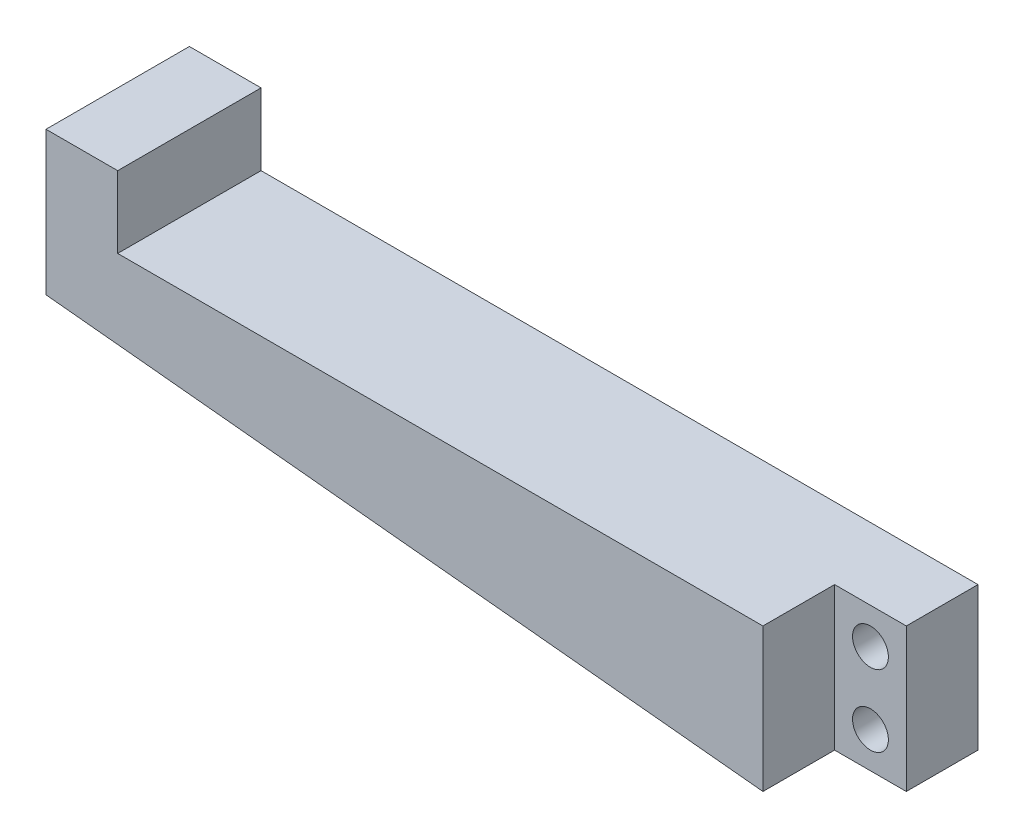
ISO-10303-21;
HEADER;
FILE_DESCRIPTION(('STEP AP214'),'2;1');
FILE_NAME('part.step','',(''),(''),'','','');
FILE_SCHEMA(('AUTOMOTIVE_DESIGN { 1 0 10303 214 1 1 1 1 }'));
ENDSEC;
DATA;
#1=APPLICATION_CONTEXT('core data for automotive mechanical design processes');
#2=APPLICATION_PROTOCOL_DEFINITION('international standard','automotive_design',2000,#1);
#3=PRODUCT_CONTEXT('',#1,'mechanical');
#4=PRODUCT('Part','Part','',(#3));
#5=PRODUCT_RELATED_PRODUCT_CATEGORY('part','',(#4));
#6=PRODUCT_DEFINITION_FORMATION('','',#4);
#7=PRODUCT_DEFINITION_CONTEXT('part definition',#1,'design');
#8=PRODUCT_DEFINITION('design','',#6,#7);
#9=PRODUCT_DEFINITION_SHAPE('','',#8);
#10=(LENGTH_UNIT() NAMED_UNIT(*) SI_UNIT(.MILLI.,.METRE.));
#11=(NAMED_UNIT(*) PLANE_ANGLE_UNIT() SI_UNIT($,.RADIAN.));
#12=(NAMED_UNIT(*) SI_UNIT($,.STERADIAN.) SOLID_ANGLE_UNIT());
#13=UNCERTAINTY_MEASURE_WITH_UNIT(LENGTH_MEASURE(1.E-05),#10,'distance_accuracy_value','');
#14=(GEOMETRIC_REPRESENTATION_CONTEXT(3) GLOBAL_UNCERTAINTY_ASSIGNED_CONTEXT((#13)) GLOBAL_UNIT_ASSIGNED_CONTEXT((#10,
#11,#12)) REPRESENTATION_CONTEXT('',''));
#15=CARTESIAN_POINT('',(0.,0.,0.));
#16=DIRECTION('',(0.,0.,1.));
#17=DIRECTION('',(1.,0.,0.));
#18=AXIS2_PLACEMENT_3D('',#15,#16,#17);
#19=CARTESIAN_POINT('',(0.,0.,20.));
#20=DIRECTION('',(0.,0.,-1.));
#21=DIRECTION('',(-1.,0.,0.));
#22=AXIS2_PLACEMENT_3D('',#19,#20,#21);
#23=PLANE('',#22);
#24=DIRECTION('',(0.995037190209989,-0.0995037190209987,0.));
#25=VECTOR('',#24,1.);
#26=CARTESIAN_POINT('',(-105.,0.,20.));
#27=LINE('',#26,#25);
#28=CARTESIAN_POINT('',(-105.,0.,20.));
#29=VERTEX_POINT('',#28);
#30=CARTESIAN_POINT('',(-5.,-10.,20.));
#31=VERTEX_POINT('',#30);
#32=EDGE_CURVE('E125',#29,#31,#27,.T.);
#33=ORIENTED_EDGE('',*,*,#32,.T.);
#34=DIRECTION('',(0.,-1.,0.));
#35=VECTOR('',#34,1.);
#36=CARTESIAN_POINT('',(-5.,-10.,20.));
#37=LINE('',#36,#35);
#38=CARTESIAN_POINT('',(-5.,10.,20.));
#39=VERTEX_POINT('',#38);
#40=EDGE_CURVE('E190',#39,#31,#37,.T.);
#41=ORIENTED_EDGE('',*,*,#40,.F.);
#42=DIRECTION('',(-1.,0.,0.));
#43=VECTOR('',#42,1.);
#44=CARTESIAN_POINT('',(-5.,10.,20.));
#45=LINE('',#44,#43);
#46=CARTESIAN_POINT('',(-95.,9.99999999999999,20.));
#47=VERTEX_POINT('',#46);
#48=EDGE_CURVE('E95',#39,#47,#45,.T.);
#49=ORIENTED_EDGE('',*,*,#48,.T.);
#50=DIRECTION('',(0.,1.,0.));
#51=VECTOR('',#50,1.);
#52=CARTESIAN_POINT('',(-95.,9.99999999999999,20.));
#53=LINE('',#52,#51);
#54=CARTESIAN_POINT('',(-95.,20.,20.));
#55=VERTEX_POINT('',#54);
#56=EDGE_CURVE('E149',#47,#55,#53,.T.);
#57=ORIENTED_EDGE('',*,*,#56,.T.);
#58=DIRECTION('',(-1.,0.,0.));
#59=VECTOR('',#58,1.);
#60=CARTESIAN_POINT('',(-105.,20.,20.));
#61=LINE('',#60,#59);
#62=CARTESIAN_POINT('',(-105.,20.,20.));
#63=VERTEX_POINT('',#62);
#64=EDGE_CURVE('E171',#55,#63,#61,.T.);
#65=ORIENTED_EDGE('',*,*,#64,.T.);
#66=DIRECTION('',(0.,-1.,0.));
#67=VECTOR('',#66,1.);
#68=CARTESIAN_POINT('',(-105.,9.99999999999999,20.));
#69=LINE('',#68,#67);
#70=EDGE_CURVE('E58',#63,#29,#69,.T.);
#71=ORIENTED_EDGE('',*,*,#70,.T.);
#72=EDGE_LOOP('',(#33,#41,#49,#57,#65,#71));
#73=FACE_BOUND('',#72,.T.);
#74=ADVANCED_FACE('F33',(#73),#23,.F.);
#75=CARTESIAN_POINT('',(0.,0.,0.));
#76=DIRECTION('',(0.,0.,-1.));
#77=DIRECTION('',(-1.,0.,0.));
#78=AXIS2_PLACEMENT_3D('',#75,#76,#77);
#79=PLANE('',#78);
#80=CARTESIAN_POINT('',(0.,5.,0.));
#81=DIRECTION('',(0.,0.,1.));
#82=DIRECTION('',(1.,0.,0.));
#83=AXIS2_PLACEMENT_3D('',#80,#81,#82);
#84=CIRCLE('',#83,2.5);
#85=CARTESIAN_POINT('',(2.5,5.,0.));
#86=VERTEX_POINT('',#85);
#87=EDGE_CURVE('E174',#86,#86,#84,.T.);
#88=ORIENTED_EDGE('',*,*,#87,.T.);
#89=EDGE_LOOP('',(#88));
#90=FACE_BOUND('',#89,.T.);
#91=DIRECTION('',(0.,1.,0.));
#92=VECTOR('',#91,1.);
#93=CARTESIAN_POINT('',(5.,-10.,0.));
#94=LINE('',#93,#92);
#95=CARTESIAN_POINT('',(5.,-10.,0.));
#96=VERTEX_POINT('',#95);
#97=CARTESIAN_POINT('',(5.,10.,0.));
#98=VERTEX_POINT('',#97);
#99=EDGE_CURVE('E162',#96,#98,#94,.T.);
#100=ORIENTED_EDGE('',*,*,#99,.F.);
#101=DIRECTION('',(1.,0.,0.));
#102=VECTOR('',#101,1.);
#103=CARTESIAN_POINT('',(-5.,-10.,0.));
#104=LINE('',#103,#102);
#105=CARTESIAN_POINT('',(-5.,-10.,0.));
#106=VERTEX_POINT('',#105);
#107=EDGE_CURVE('E122',#106,#96,#104,.T.);
#108=ORIENTED_EDGE('',*,*,#107,.F.);
#109=DIRECTION('',(0.995037190209989,-0.0995037190209987,0.));
#110=VECTOR('',#109,1.);
#111=CARTESIAN_POINT('',(-105.,0.,0.));
#112=LINE('',#111,#110);
#113=CARTESIAN_POINT('',(-105.,0.,0.));
#114=VERTEX_POINT('',#113);
#115=EDGE_CURVE('E166',#114,#106,#112,.T.);
#116=ORIENTED_EDGE('',*,*,#115,.F.);
#117=DIRECTION('',(0.,-1.,0.));
#118=VECTOR('',#117,1.);
#119=CARTESIAN_POINT('',(-105.,9.99999999999999,0.));
#120=LINE('',#119,#118);
#121=CARTESIAN_POINT('',(-105.,20.,0.));
#122=VERTEX_POINT('',#121);
#123=EDGE_CURVE('E160',#122,#114,#120,.T.);
#124=ORIENTED_EDGE('',*,*,#123,.F.);
#125=DIRECTION('',(-1.,0.,0.));
#126=VECTOR('',#125,1.);
#127=CARTESIAN_POINT('',(-105.,20.,0.));
#128=LINE('',#127,#126);
#129=CARTESIAN_POINT('',(-95.,20.,0.));
#130=VERTEX_POINT('',#129);
#131=EDGE_CURVE('E158',#130,#122,#128,.T.);
#132=ORIENTED_EDGE('',*,*,#131,.F.);
#133=DIRECTION('',(0.,1.,0.));
#134=VECTOR('',#133,1.);
#135=CARTESIAN_POINT('',(-95.,9.99999999999999,0.));
#136=LINE('',#135,#134);
#137=CARTESIAN_POINT('',(-95.,9.99999999999999,0.));
#138=VERTEX_POINT('',#137);
#139=EDGE_CURVE('E148',#138,#130,#136,.T.);
#140=ORIENTED_EDGE('',*,*,#139,.F.);
#141=DIRECTION('',(-1.,0.,0.));
#142=VECTOR('',#141,1.);
#143=CARTESIAN_POINT('',(-5.,10.,0.));
#144=LINE('',#143,#142);
#145=EDGE_CURVE('E156',#98,#138,#144,.T.);
#146=ORIENTED_EDGE('',*,*,#145,.F.);
#147=EDGE_LOOP('',(#100,#108,#116,#124,#132,#140,#146));
#148=FACE_BOUND('',#147,.T.);
#149=CARTESIAN_POINT('',(0.,-5.,0.));
#150=DIRECTION('',(0.,0.,1.));
#151=DIRECTION('',(1.,0.,0.));
#152=AXIS2_PLACEMENT_3D('',#149,#150,#151);
#153=CIRCLE('',#152,2.5);
#154=CARTESIAN_POINT('',(2.5,-5.,0.));
#155=VERTEX_POINT('',#154);
#156=EDGE_CURVE('E179',#155,#155,#153,.T.);
#157=ORIENTED_EDGE('',*,*,#156,.T.);
#158=EDGE_LOOP('',(#157));
#159=FACE_BOUND('',#158,.T.);
#160=ADVANCED_FACE('F154',(#90,#148,#159),#79,.T.);
#161=CARTESIAN_POINT('',(5.,-10.,20.));
#162=DIRECTION('',(-1.,0.,0.));
#163=DIRECTION('',(0.,0.,1.));
#164=AXIS2_PLACEMENT_3D('',#161,#162,#163);
#165=PLANE('',#164);
#166=DIRECTION('',(0.,0.,-1.));
#167=VECTOR('',#166,1.);
#168=CARTESIAN_POINT('',(5.,10.,20.));
#169=LINE('',#168,#167);
#170=CARTESIAN_POINT('',(5.,10.,10.));
#171=VERTEX_POINT('',#170);
#172=EDGE_CURVE('E11',#171,#98,#169,.T.);
#173=ORIENTED_EDGE('',*,*,#172,.F.);
#174=DIRECTION('',(0.,1.,0.));
#175=VECTOR('',#174,1.);
#176=CARTESIAN_POINT('',(5.,-10.,10.));
#177=LINE('',#176,#175);
#178=CARTESIAN_POINT('',(5.,-10.,10.));
#179=VERTEX_POINT('',#178);
#180=EDGE_CURVE('E112',#179,#171,#177,.T.);
#181=ORIENTED_EDGE('',*,*,#180,.F.);
#182=DIRECTION('',(0.,0.,-1.));
#183=VECTOR('',#182,1.);
#184=CARTESIAN_POINT('',(5.,-10.,20.));
#185=LINE('',#184,#183);
#186=EDGE_CURVE('E88',#179,#96,#185,.T.);
#187=ORIENTED_EDGE('',*,*,#186,.T.);
#188=ORIENTED_EDGE('',*,*,#99,.T.);
#189=EDGE_LOOP('',(#173,#181,#187,#188));
#190=FACE_BOUND('',#189,.T.);
#191=ADVANCED_FACE('F35',(#190),#165,.F.);
#192=CARTESIAN_POINT('',(-5.,10.,20.));
#193=DIRECTION('',(0.,-1.,0.));
#194=DIRECTION('',(1.,0.,0.));
#195=AXIS2_PLACEMENT_3D('',#192,#193,#194);
#196=PLANE('',#195);
#197=ORIENTED_EDGE('',*,*,#48,.F.);
#198=DIRECTION('',(0.,0.,1.));
#199=VECTOR('',#198,1.);
#200=CARTESIAN_POINT('',(-5.,10.,10.));
#201=LINE('',#200,#199);
#202=CARTESIAN_POINT('',(-5.,10.,10.));
#203=VERTEX_POINT('',#202);
#204=EDGE_CURVE('E188',#203,#39,#201,.T.);
#205=ORIENTED_EDGE('',*,*,#204,.F.);
#206=DIRECTION('',(-1.,0.,0.));
#207=VECTOR('',#206,1.);
#208=CARTESIAN_POINT('',(-5.,10.,10.));
#209=LINE('',#208,#207);
#210=EDGE_CURVE('E118',#171,#203,#209,.T.);
#211=ORIENTED_EDGE('',*,*,#210,.F.);
#212=ORIENTED_EDGE('',*,*,#172,.T.);
#213=ORIENTED_EDGE('',*,*,#145,.T.);
#214=DIRECTION('',(0.,0.,-1.));
#215=VECTOR('',#214,1.);
#216=CARTESIAN_POINT('',(-95.,9.99999999999999,20.));
#217=LINE('',#216,#215);
#218=EDGE_CURVE('E42',#47,#138,#217,.T.);
#219=ORIENTED_EDGE('',*,*,#218,.F.);
#220=EDGE_LOOP('',(#197,#205,#211,#212,#213,#219));
#221=FACE_BOUND('',#220,.T.);
#222=ADVANCED_FACE('F194',(#221),#196,.F.);
#223=CARTESIAN_POINT('',(-95.,9.99999999999999,20.));
#224=DIRECTION('',(-1.,0.,0.));
#225=DIRECTION('',(0.,0.,1.));
#226=AXIS2_PLACEMENT_3D('',#223,#224,#225);
#227=PLANE('',#226);
#228=ORIENTED_EDGE('',*,*,#139,.T.);
#229=DIRECTION('',(0.,0.,-1.));
#230=VECTOR('',#229,1.);
#231=CARTESIAN_POINT('',(-95.,20.,20.));
#232=LINE('',#231,#230);
#233=EDGE_CURVE('E139',#55,#130,#232,.T.);
#234=ORIENTED_EDGE('',*,*,#233,.F.);
#235=ORIENTED_EDGE('',*,*,#56,.F.);
#236=ORIENTED_EDGE('',*,*,#218,.T.);
#237=EDGE_LOOP('',(#228,#234,#235,#236));
#238=FACE_BOUND('',#237,.T.);
#239=ADVANCED_FACE('F146',(#238),#227,.F.);
#240=CARTESIAN_POINT('',(-105.,20.,20.));
#241=DIRECTION('',(0.,-1.,0.));
#242=DIRECTION('',(0.,0.,-1.));
#243=AXIS2_PLACEMENT_3D('',#240,#241,#242);
#244=PLANE('',#243);
#245=ORIENTED_EDGE('',*,*,#131,.T.);
#246=DIRECTION('',(0.,0.,-1.));
#247=VECTOR('',#246,1.);
#248=CARTESIAN_POINT('',(-105.,20.,20.));
#249=LINE('',#248,#247);
#250=EDGE_CURVE('E136',#63,#122,#249,.T.);
#251=ORIENTED_EDGE('',*,*,#250,.F.);
#252=ORIENTED_EDGE('',*,*,#64,.F.);
#253=ORIENTED_EDGE('',*,*,#233,.T.);
#254=EDGE_LOOP('',(#245,#251,#252,#253));
#255=FACE_BOUND('',#254,.T.);
#256=ADVANCED_FACE('F209',(#255),#244,.F.);
#257=CARTESIAN_POINT('',(-105.,9.99999999999999,20.));
#258=DIRECTION('',(1.,0.,0.));
#259=DIRECTION('',(0.,0.,-1.));
#260=AXIS2_PLACEMENT_3D('',#257,#258,#259);
#261=PLANE('',#260);
#262=ORIENTED_EDGE('',*,*,#123,.T.);
#263=DIRECTION('',(0.,0.,-1.));
#264=VECTOR('',#263,1.);
#265=CARTESIAN_POINT('',(-105.,0.,20.));
#266=LINE('',#265,#264);
#267=EDGE_CURVE('E133',#29,#114,#266,.T.);
#268=ORIENTED_EDGE('',*,*,#267,.F.);
#269=ORIENTED_EDGE('',*,*,#70,.F.);
#270=ORIENTED_EDGE('',*,*,#250,.T.);
#271=EDGE_LOOP('',(#262,#268,#269,#270));
#272=FACE_BOUND('',#271,.T.);
#273=ADVANCED_FACE('F201',(#272),#261,.F.);
#274=CARTESIAN_POINT('',(-105.,0.,20.));
#275=DIRECTION('',(0.0995037190209987,0.995037190209989,0.));
#276=DIRECTION('',(-0.995037190209989,0.0995037190209988,0.));
#277=AXIS2_PLACEMENT_3D('',#274,#275,#276);
#278=PLANE('',#277);
#279=ORIENTED_EDGE('',*,*,#115,.T.);
#280=DIRECTION('',(0.,0.,-1.));
#281=VECTOR('',#280,1.);
#282=CARTESIAN_POINT('',(-5.,-10.,20.));
#283=LINE('',#282,#281);
#284=CARTESIAN_POINT('',(-5.,-10.,10.));
#285=VERTEX_POINT('',#284);
#286=EDGE_CURVE('E124',#285,#106,#283,.T.);
#287=ORIENTED_EDGE('',*,*,#286,.F.);
#288=EDGE_CURVE('E127',#31,#285,#283,.T.);
#289=ORIENTED_EDGE('',*,*,#288,.F.);
#290=ORIENTED_EDGE('',*,*,#32,.F.);
#291=ORIENTED_EDGE('',*,*,#267,.T.);
#292=EDGE_LOOP('',(#279,#287,#289,#290,#291));
#293=FACE_BOUND('',#292,.T.);
#294=ADVANCED_FACE('F199',(#293),#278,.F.);
#295=CARTESIAN_POINT('',(-5.,-10.,20.));
#296=DIRECTION('',(0.,1.,0.));
#297=DIRECTION('',(0.,0.,1.));
#298=AXIS2_PLACEMENT_3D('',#295,#296,#297);
#299=PLANE('',#298);
#300=ORIENTED_EDGE('',*,*,#186,.F.);
#301=DIRECTION('',(1.,0.,0.));
#302=VECTOR('',#301,1.);
#303=CARTESIAN_POINT('',(-5.,-10.,10.));
#304=LINE('',#303,#302);
#305=EDGE_CURVE('E110',#285,#179,#304,.T.);
#306=ORIENTED_EDGE('',*,*,#305,.F.);
#307=ORIENTED_EDGE('',*,*,#286,.T.);
#308=ORIENTED_EDGE('',*,*,#107,.T.);
#309=EDGE_LOOP('',(#300,#306,#307,#308));
#310=FACE_BOUND('',#309,.T.);
#311=ADVANCED_FACE('F120',(#310),#299,.F.);
#312=CARTESIAN_POINT('',(0.,5.,20.));
#313=DIRECTION('',(0.,0.,-1.));
#314=DIRECTION('',(-1.,0.,0.));
#315=AXIS2_PLACEMENT_3D('',#312,#313,#314);
#316=CYLINDRICAL_SURFACE('',#315,2.5);
#317=CARTESIAN_POINT('',(0.,5.,10.));
#318=DIRECTION('',(0.,0.,-1.));
#319=DIRECTION('',(-1.,0.,0.));
#320=AXIS2_PLACEMENT_3D('',#317,#318,#319);
#321=CIRCLE('',#320,2.5);
#322=CARTESIAN_POINT('',(-2.5,5.,10.));
#323=VERTEX_POINT('',#322);
#324=EDGE_CURVE('E183',#323,#323,#321,.T.);
#325=ORIENTED_EDGE('',*,*,#324,.F.);
#326=EDGE_LOOP('',(#325));
#327=FACE_BOUND('',#326,.T.);
#328=ORIENTED_EDGE('',*,*,#87,.F.);
#329=EDGE_LOOP('',(#328));
#330=FACE_BOUND('',#329,.T.);
#331=ADVANCED_FACE('F207',(#327,#330),#316,.F.);
#332=CARTESIAN_POINT('',(0.,-5.,20.));
#333=DIRECTION('',(0.,0.,-1.));
#334=DIRECTION('',(-1.,0.,0.));
#335=AXIS2_PLACEMENT_3D('',#332,#333,#334);
#336=CYLINDRICAL_SURFACE('',#335,2.5);
#337=CARTESIAN_POINT('',(0.,-5.,10.));
#338=DIRECTION('',(0.,0.,-1.));
#339=DIRECTION('',(-1.,0.,0.));
#340=AXIS2_PLACEMENT_3D('',#337,#338,#339);
#341=CIRCLE('',#340,2.5);
#342=CARTESIAN_POINT('',(-2.5,-5.,10.));
#343=VERTEX_POINT('',#342);
#344=EDGE_CURVE('E37',#343,#343,#341,.T.);
#345=ORIENTED_EDGE('',*,*,#344,.F.);
#346=EDGE_LOOP('',(#345));
#347=FACE_BOUND('',#346,.T.);
#348=ORIENTED_EDGE('',*,*,#156,.F.);
#349=EDGE_LOOP('',(#348));
#350=FACE_BOUND('',#349,.T.);
#351=ADVANCED_FACE('F221',(#347,#350),#336,.F.);
#352=CARTESIAN_POINT('',(-5.,-10.,10.));
#353=DIRECTION('',(-1.,0.,0.));
#354=DIRECTION('',(0.,0.,1.));
#355=AXIS2_PLACEMENT_3D('',#352,#353,#354);
#356=PLANE('',#355);
#357=ORIENTED_EDGE('',*,*,#40,.T.);
#358=ORIENTED_EDGE('',*,*,#288,.T.);
#359=DIRECTION('',(0.,-1.,0.));
#360=VECTOR('',#359,1.);
#361=CARTESIAN_POINT('',(-5.,-10.,10.));
#362=LINE('',#361,#360);
#363=EDGE_CURVE('E49',#203,#285,#362,.T.);
#364=ORIENTED_EDGE('',*,*,#363,.F.);
#365=ORIENTED_EDGE('',*,*,#204,.T.);
#366=EDGE_LOOP('',(#357,#358,#364,#365));
#367=FACE_BOUND('',#366,.T.);
#368=ADVANCED_FACE('F196',(#367),#356,.F.);
#369=CARTESIAN_POINT('',(0.,0.,10.));
#370=DIRECTION('',(0.,0.,-1.));
#371=DIRECTION('',(-1.,0.,0.));
#372=AXIS2_PLACEMENT_3D('',#369,#370,#371);
#373=PLANE('',#372);
#374=ORIENTED_EDGE('',*,*,#324,.T.);
#375=EDGE_LOOP('',(#374));
#376=FACE_BOUND('',#375,.T.);
#377=ORIENTED_EDGE('',*,*,#344,.T.);
#378=EDGE_LOOP('',(#377));
#379=FACE_BOUND('',#378,.T.);
#380=ORIENTED_EDGE('',*,*,#363,.T.);
#381=ORIENTED_EDGE('',*,*,#305,.T.);
#382=ORIENTED_EDGE('',*,*,#180,.T.);
#383=ORIENTED_EDGE('',*,*,#210,.T.);
#384=EDGE_LOOP('',(#380,#381,#382,#383));
#385=FACE_BOUND('',#384,.T.);
#386=ADVANCED_FACE('F111',(#376,#379,#385),#373,.F.);
#387=CLOSED_SHELL('',(#74,#160,#191,#222,#239,#256,#273,#294,#311,#331,#351,#368,#386));
#388=MANIFOLD_SOLID_BREP('B2',#387);
#389=ADVANCED_BREP_SHAPE_REPRESENTATION('',(#18,#388),#14);
#390=SHAPE_DEFINITION_REPRESENTATION(#9,#389);
ENDSEC;
END-ISO-10303-21;
